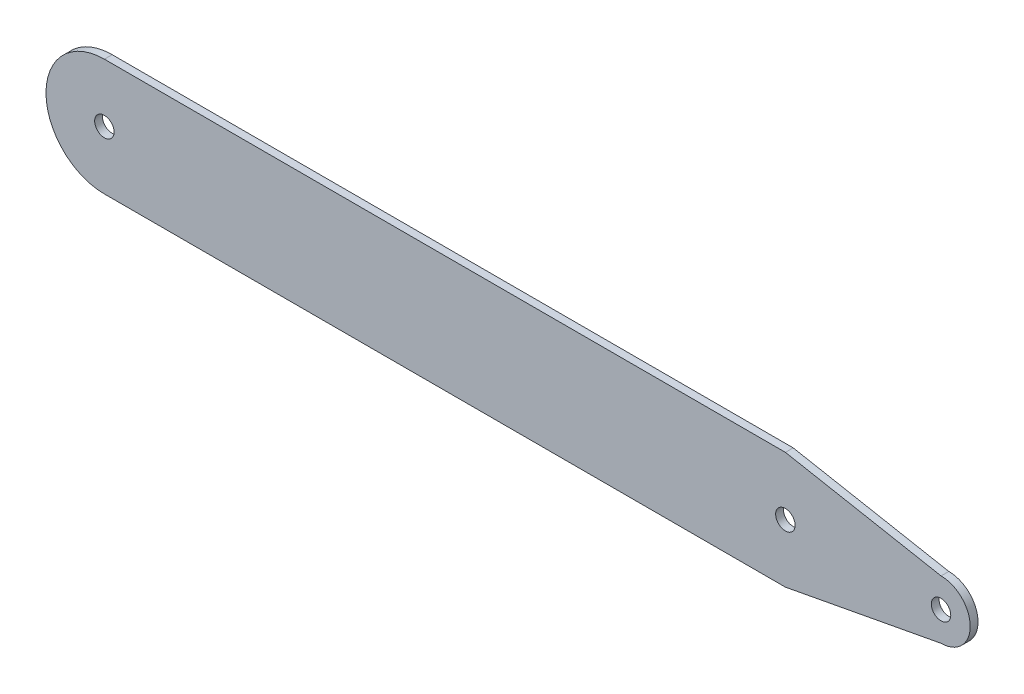
ISO-10303-21;
HEADER;
FILE_DESCRIPTION(('STEP AP214'),'2;1');
FILE_NAME('part.step','',(''),(''),'','','');
FILE_SCHEMA(('AUTOMOTIVE_DESIGN { 1 0 10303 214 1 1 1 1 }'));
ENDSEC;
DATA;
#1=APPLICATION_CONTEXT('core data for automotive mechanical design processes');
#2=APPLICATION_PROTOCOL_DEFINITION('international standard','automotive_design',2000,#1);
#3=PRODUCT_CONTEXT('',#1,'mechanical');
#4=PRODUCT('Part','Part','',(#3));
#5=PRODUCT_RELATED_PRODUCT_CATEGORY('part','',(#4));
#6=PRODUCT_DEFINITION_FORMATION('','',#4);
#7=PRODUCT_DEFINITION_CONTEXT('part definition',#1,'design');
#8=PRODUCT_DEFINITION('design','',#6,#7);
#9=PRODUCT_DEFINITION_SHAPE('','',#8);
#10=(LENGTH_UNIT() NAMED_UNIT(*) SI_UNIT(.MILLI.,.METRE.));
#11=(NAMED_UNIT(*) PLANE_ANGLE_UNIT() SI_UNIT($,.RADIAN.));
#12=(NAMED_UNIT(*) SI_UNIT($,.STERADIAN.) SOLID_ANGLE_UNIT());
#13=UNCERTAINTY_MEASURE_WITH_UNIT(LENGTH_MEASURE(1.E-05),#10,'distance_accuracy_value','');
#14=(GEOMETRIC_REPRESENTATION_CONTEXT(3) GLOBAL_UNCERTAINTY_ASSIGNED_CONTEXT((#13)) GLOBAL_UNIT_ASSIGNED_CONTEXT((#10,
#11,#12)) REPRESENTATION_CONTEXT('',''));
#15=CARTESIAN_POINT('',(0.,0.,0.));
#16=DIRECTION('',(0.,0.,1.));
#17=DIRECTION('',(1.,0.,0.));
#18=AXIS2_PLACEMENT_3D('',#15,#16,#17);
#19=CARTESIAN_POINT('',(428.542857142857,-0.145714285714277,4.));
#20=DIRECTION('',(0.,0.,1.));
#21=DIRECTION('',(1.,0.,0.));
#22=AXIS2_PLACEMENT_3D('',#19,#20,#21);
#23=PLANE('',#22);
#24=CARTESIAN_POINT('',(-1.45714285714287,-0.145714285714277,4.));
#25=DIRECTION('',(0.,0.,1.));
#26=DIRECTION('',(1.,0.,0.));
#27=AXIS2_PLACEMENT_3D('',#24,#25,#26);
#28=CIRCLE('',#27,5.);
#29=CARTESIAN_POINT('',(3.54285714285713,-0.145714285714277,4.));
#30=VERTEX_POINT('',#29);
#31=EDGE_CURVE('E207',#30,#30,#28,.T.);
#32=ORIENTED_EDGE('',*,*,#31,.F.);
#33=EDGE_LOOP('',(#32));
#34=FACE_BOUND('',#33,.T.);
#35=CARTESIAN_POINT('',(428.542857142857,-0.145714285714277,4.));
#36=DIRECTION('',(0.,0.,1.));
#37=DIRECTION('',(1.,0.,0.));
#38=AXIS2_PLACEMENT_3D('',#35,#36,#37);
#39=CIRCLE('',#38,15.);
#40=CARTESIAN_POINT('',(428.542857142857,-15.1457142857143,4.));
#41=VERTEX_POINT('',#40);
#42=CARTESIAN_POINT('',(428.542857142857,14.8542857142857,4.));
#43=VERTEX_POINT('',#42);
#44=EDGE_CURVE('E146',#41,#43,#39,.T.);
#45=ORIENTED_EDGE('',*,*,#44,.T.);
#46=DIRECTION('',(-0.982872186934322,0.184288535050186,0.));
#47=VECTOR('',#46,1.);
#48=CARTESIAN_POINT('',(428.542857142857,14.8542857142857,4.));
#49=LINE('',#48,#47);
#50=CARTESIAN_POINT('',(348.542857142857,29.8542857142858,4.));
#51=VERTEX_POINT('',#50);
#52=EDGE_CURVE('E94',#43,#51,#49,.T.);
#53=ORIENTED_EDGE('',*,*,#52,.T.);
#54=DIRECTION('',(-1.,0.,0.));
#55=VECTOR('',#54,1.);
#56=CARTESIAN_POINT('',(-1.45714285714287,29.8542857142857,4.));
#57=LINE('',#56,#55);
#58=CARTESIAN_POINT('',(-1.45714285714286,29.8542857142857,4.));
#59=VERTEX_POINT('',#58);
#60=EDGE_CURVE('E107',#51,#59,#57,.T.);
#61=ORIENTED_EDGE('',*,*,#60,.T.);
#62=CARTESIAN_POINT('',(-1.45714285714286,-0.145714285714277,4.));
#63=DIRECTION('',(0.,0.,1.));
#64=DIRECTION('',(-1.,0.,0.));
#65=AXIS2_PLACEMENT_3D('',#62,#63,#64);
#66=CIRCLE('',#65,30.);
#67=CARTESIAN_POINT('',(-1.45714285714287,-30.1457142857143,4.));
#68=VERTEX_POINT('',#67);
#69=EDGE_CURVE('E101',#59,#68,#66,.T.);
#70=ORIENTED_EDGE('',*,*,#69,.T.);
#71=DIRECTION('',(1.,0.,0.));
#72=VECTOR('',#71,1.);
#73=CARTESIAN_POINT('',(348.542857142857,-30.1457142857143,4.));
#74=LINE('',#73,#72);
#75=CARTESIAN_POINT('',(348.542857142857,-30.1457142857143,4.));
#76=VERTEX_POINT('',#75);
#77=EDGE_CURVE('E105',#68,#76,#74,.T.);
#78=ORIENTED_EDGE('',*,*,#77,.T.);
#79=DIRECTION('',(0.982872186934322,0.184288535050186,0.));
#80=VECTOR('',#79,1.);
#81=CARTESIAN_POINT('',(428.542857142857,-15.1457142857143,4.));
#82=LINE('',#81,#80);
#83=EDGE_CURVE('E57',#76,#41,#82,.T.);
#84=ORIENTED_EDGE('',*,*,#83,.T.);
#85=EDGE_LOOP('',(#45,#53,#61,#70,#78,#84));
#86=FACE_BOUND('',#85,.T.);
#87=CARTESIAN_POINT('',(428.542857142857,-0.145714285714277,4.));
#88=DIRECTION('',(0.,0.,1.));
#89=DIRECTION('',(1.,0.,0.));
#90=AXIS2_PLACEMENT_3D('',#87,#88,#89);
#91=CIRCLE('',#90,4.99999999999999);
#92=CARTESIAN_POINT('',(433.542857142857,-0.145714285714277,4.));
#93=VERTEX_POINT('',#92);
#94=EDGE_CURVE('E134',#93,#93,#91,.T.);
#95=ORIENTED_EDGE('',*,*,#94,.F.);
#96=EDGE_LOOP('',(#95));
#97=FACE_BOUND('',#96,.T.);
#98=CARTESIAN_POINT('',(348.542857142857,-0.145714285714277,4.));
#99=DIRECTION('',(0.,0.,1.));
#100=DIRECTION('',(1.,0.,0.));
#101=AXIS2_PLACEMENT_3D('',#98,#99,#100);
#102=CIRCLE('',#101,4.99999999999999);
#103=CARTESIAN_POINT('',(353.542857142857,-0.145714285714277,4.));
#104=VERTEX_POINT('',#103);
#105=EDGE_CURVE('E196',#104,#104,#102,.T.);
#106=ORIENTED_EDGE('',*,*,#105,.F.);
#107=EDGE_LOOP('',(#106));
#108=FACE_BOUND('',#107,.T.);
#109=ADVANCED_FACE('F39',(#34,#86,#97,#108),#23,.T.);
#110=CARTESIAN_POINT('',(428.542857142857,-0.145714285714277,0.));
#111=DIRECTION('',(0.,0.,1.));
#112=DIRECTION('',(1.,0.,0.));
#113=AXIS2_PLACEMENT_3D('',#110,#111,#112);
#114=PLANE('',#113);
#115=CARTESIAN_POINT('',(428.542857142857,-0.145714285714277,0.));
#116=DIRECTION('',(0.,0.,1.));
#117=DIRECTION('',(1.,0.,0.));
#118=AXIS2_PLACEMENT_3D('',#115,#116,#117);
#119=CIRCLE('',#118,15.);
#120=CARTESIAN_POINT('',(428.542857142857,-15.1457142857143,0.));
#121=VERTEX_POINT('',#120);
#122=CARTESIAN_POINT('',(428.542857142857,14.8542857142857,0.));
#123=VERTEX_POINT('',#122);
#124=EDGE_CURVE('E129',#121,#123,#119,.T.);
#125=ORIENTED_EDGE('',*,*,#124,.F.);
#126=DIRECTION('',(0.982872186934322,0.184288535050186,0.));
#127=VECTOR('',#126,1.);
#128=CARTESIAN_POINT('',(428.542857142857,-15.1457142857143,0.));
#129=LINE('',#128,#127);
#130=CARTESIAN_POINT('',(348.542857142857,-30.1457142857143,0.));
#131=VERTEX_POINT('',#130);
#132=EDGE_CURVE('E86',#131,#121,#129,.T.);
#133=ORIENTED_EDGE('',*,*,#132,.F.);
#134=DIRECTION('',(1.,0.,0.));
#135=VECTOR('',#134,1.);
#136=CARTESIAN_POINT('',(348.542857142857,-30.1457142857143,0.));
#137=LINE('',#136,#135);
#138=CARTESIAN_POINT('',(-1.45714285714287,-30.1457142857143,0.));
#139=VERTEX_POINT('',#138);
#140=EDGE_CURVE('E80',#139,#131,#137,.T.);
#141=ORIENTED_EDGE('',*,*,#140,.F.);
#142=CARTESIAN_POINT('',(-1.45714285714286,-0.145714285714277,0.));
#143=DIRECTION('',(0.,0.,1.));
#144=DIRECTION('',(-1.,0.,0.));
#145=AXIS2_PLACEMENT_3D('',#142,#143,#144);
#146=CIRCLE('',#145,30.);
#147=CARTESIAN_POINT('',(-1.45714285714286,29.8542857142857,0.));
#148=VERTEX_POINT('',#147);
#149=EDGE_CURVE('E116',#148,#139,#146,.T.);
#150=ORIENTED_EDGE('',*,*,#149,.F.);
#151=DIRECTION('',(-1.,0.,0.));
#152=VECTOR('',#151,1.);
#153=CARTESIAN_POINT('',(-1.45714285714287,29.8542857142857,0.));
#154=LINE('',#153,#152);
#155=CARTESIAN_POINT('',(348.542857142857,29.8542857142858,0.));
#156=VERTEX_POINT('',#155);
#157=EDGE_CURVE('E137',#156,#148,#154,.T.);
#158=ORIENTED_EDGE('',*,*,#157,.F.);
#159=DIRECTION('',(-0.982872186934322,0.184288535050186,0.));
#160=VECTOR('',#159,1.);
#161=CARTESIAN_POINT('',(428.542857142857,14.8542857142857,0.));
#162=LINE('',#161,#160);
#163=EDGE_CURVE('E133',#123,#156,#162,.T.);
#164=ORIENTED_EDGE('',*,*,#163,.F.);
#165=EDGE_LOOP('',(#125,#133,#141,#150,#158,#164));
#166=FACE_BOUND('',#165,.T.);
#167=CARTESIAN_POINT('',(428.542857142857,-0.145714285714277,0.));
#168=DIRECTION('',(0.,0.,1.));
#169=DIRECTION('',(1.,0.,0.));
#170=AXIS2_PLACEMENT_3D('',#167,#168,#169);
#171=CIRCLE('',#170,4.99999999999999);
#172=CARTESIAN_POINT('',(433.542857142857,-0.145714285714277,0.));
#173=VERTEX_POINT('',#172);
#174=EDGE_CURVE('E211',#173,#173,#171,.T.);
#175=ORIENTED_EDGE('',*,*,#174,.T.);
#176=EDGE_LOOP('',(#175));
#177=FACE_BOUND('',#176,.T.);
#178=CARTESIAN_POINT('',(-1.45714285714287,-0.145714285714277,0.));
#179=DIRECTION('',(0.,0.,1.));
#180=DIRECTION('',(1.,0.,0.));
#181=AXIS2_PLACEMENT_3D('',#178,#179,#180);
#182=CIRCLE('',#181,5.);
#183=CARTESIAN_POINT('',(3.54285714285713,-0.145714285714277,0.));
#184=VERTEX_POINT('',#183);
#185=EDGE_CURVE('E204',#184,#184,#182,.T.);
#186=ORIENTED_EDGE('',*,*,#185,.T.);
#187=EDGE_LOOP('',(#186));
#188=FACE_BOUND('',#187,.T.);
#189=CARTESIAN_POINT('',(348.542857142857,-0.145714285714277,0.));
#190=DIRECTION('',(0.,0.,1.));
#191=DIRECTION('',(1.,0.,0.));
#192=AXIS2_PLACEMENT_3D('',#189,#190,#191);
#193=CIRCLE('',#192,4.99999999999999);
#194=CARTESIAN_POINT('',(353.542857142857,-0.145714285714277,0.));
#195=VERTEX_POINT('',#194);
#196=EDGE_CURVE('E199',#195,#195,#193,.T.);
#197=ORIENTED_EDGE('',*,*,#196,.T.);
#198=EDGE_LOOP('',(#197));
#199=FACE_BOUND('',#198,.T.);
#200=ADVANCED_FACE('F159',(#166,#177,#188,#199),#114,.F.);
#201=CARTESIAN_POINT('',(428.542857142857,-0.145714285714277,4.));
#202=DIRECTION('',(0.,0.,-1.));
#203=DIRECTION('',(-1.,0.,0.));
#204=AXIS2_PLACEMENT_3D('',#201,#202,#203);
#205=CYLINDRICAL_SURFACE('',#204,15.);
#206=ORIENTED_EDGE('',*,*,#124,.T.);
#207=DIRECTION('',(0.,0.,-1.));
#208=VECTOR('',#207,1.);
#209=CARTESIAN_POINT('',(428.542857142857,14.8542857142857,4.));
#210=LINE('',#209,#208);
#211=EDGE_CURVE('E11',#43,#123,#210,.T.);
#212=ORIENTED_EDGE('',*,*,#211,.F.);
#213=ORIENTED_EDGE('',*,*,#44,.F.);
#214=DIRECTION('',(0.,0.,-1.));
#215=VECTOR('',#214,1.);
#216=CARTESIAN_POINT('',(428.542857142857,-15.1457142857143,4.));
#217=LINE('',#216,#215);
#218=EDGE_CURVE('E125',#41,#121,#217,.T.);
#219=ORIENTED_EDGE('',*,*,#218,.T.);
#220=EDGE_LOOP('',(#206,#212,#213,#219));
#221=FACE_BOUND('',#220,.T.);
#222=ADVANCED_FACE('F41',(#221),#205,.T.);
#223=CARTESIAN_POINT('',(428.542857142857,14.8542857142857,4.));
#224=DIRECTION('',(-0.184288535050186,-0.982872186934322,0.));
#225=DIRECTION('',(0.982872186934322,-0.184288535050186,0.));
#226=AXIS2_PLACEMENT_3D('',#223,#224,#225);
#227=PLANE('',#226);
#228=ORIENTED_EDGE('',*,*,#163,.T.);
#229=DIRECTION('',(0.,0.,-1.));
#230=VECTOR('',#229,1.);
#231=CARTESIAN_POINT('',(348.542857142857,29.8542857142858,4.));
#232=LINE('',#231,#230);
#233=EDGE_CURVE('E49',#51,#156,#232,.T.);
#234=ORIENTED_EDGE('',*,*,#233,.F.);
#235=ORIENTED_EDGE('',*,*,#52,.F.);
#236=ORIENTED_EDGE('',*,*,#211,.T.);
#237=EDGE_LOOP('',(#228,#234,#235,#236));
#238=FACE_BOUND('',#237,.T.);
#239=ADVANCED_FACE('F267',(#238),#227,.F.);
#240=CARTESIAN_POINT('',(-1.45714285714287,29.8542857142857,4.));
#241=DIRECTION('',(0.,-1.,0.));
#242=DIRECTION('',(1.,0.,0.));
#243=AXIS2_PLACEMENT_3D('',#240,#241,#242);
#244=PLANE('',#243);
#245=ORIENTED_EDGE('',*,*,#157,.T.);
#246=DIRECTION('',(0.,0.,-1.));
#247=VECTOR('',#246,1.);
#248=CARTESIAN_POINT('',(-1.45714285714286,29.8542857142857,4.));
#249=LINE('',#248,#247);
#250=EDGE_CURVE('E118',#59,#148,#249,.T.);
#251=ORIENTED_EDGE('',*,*,#250,.F.);
#252=ORIENTED_EDGE('',*,*,#60,.F.);
#253=ORIENTED_EDGE('',*,*,#233,.T.);
#254=EDGE_LOOP('',(#245,#251,#252,#253));
#255=FACE_BOUND('',#254,.T.);
#256=ADVANCED_FACE('F156',(#255),#244,.F.);
#257=CARTESIAN_POINT('',(-1.45714285714286,-0.145714285714277,4.));
#258=DIRECTION('',(0.,0.,-1.));
#259=DIRECTION('',(-1.,0.,0.));
#260=AXIS2_PLACEMENT_3D('',#257,#258,#259);
#261=CYLINDRICAL_SURFACE('',#260,30.);
#262=ORIENTED_EDGE('',*,*,#149,.T.);
#263=DIRECTION('',(0.,0.,-1.));
#264=VECTOR('',#263,1.);
#265=CARTESIAN_POINT('',(-1.45714285714287,-30.1457142857143,4.));
#266=LINE('',#265,#264);
#267=EDGE_CURVE('E113',#68,#139,#266,.T.);
#268=ORIENTED_EDGE('',*,*,#267,.F.);
#269=ORIENTED_EDGE('',*,*,#69,.F.);
#270=ORIENTED_EDGE('',*,*,#250,.T.);
#271=EDGE_LOOP('',(#262,#268,#269,#270));
#272=FACE_BOUND('',#271,.T.);
#273=ADVANCED_FACE('F114',(#272),#261,.T.);
#274=CARTESIAN_POINT('',(348.542857142857,-30.1457142857143,4.));
#275=DIRECTION('',(0.,1.,0.));
#276=DIRECTION('',(-1.,0.,0.));
#277=AXIS2_PLACEMENT_3D('',#274,#275,#276);
#278=PLANE('',#277);
#279=ORIENTED_EDGE('',*,*,#140,.T.);
#280=DIRECTION('',(0.,0.,-1.));
#281=VECTOR('',#280,1.);
#282=CARTESIAN_POINT('',(348.542857142857,-30.1457142857143,4.));
#283=LINE('',#282,#281);
#284=EDGE_CURVE('E119',#76,#131,#283,.T.);
#285=ORIENTED_EDGE('',*,*,#284,.F.);
#286=ORIENTED_EDGE('',*,*,#77,.F.);
#287=ORIENTED_EDGE('',*,*,#267,.T.);
#288=EDGE_LOOP('',(#279,#285,#286,#287));
#289=FACE_BOUND('',#288,.T.);
#290=ADVANCED_FACE('F121',(#289),#278,.F.);
#291=CARTESIAN_POINT('',(428.542857142857,-15.1457142857143,4.));
#292=DIRECTION('',(-0.184288535050186,0.982872186934322,0.));
#293=DIRECTION('',(-0.982872186934322,-0.184288535050186,0.));
#294=AXIS2_PLACEMENT_3D('',#291,#292,#293);
#295=PLANE('',#294);
#296=ORIENTED_EDGE('',*,*,#132,.T.);
#297=ORIENTED_EDGE('',*,*,#218,.F.);
#298=ORIENTED_EDGE('',*,*,#83,.F.);
#299=ORIENTED_EDGE('',*,*,#284,.T.);
#300=EDGE_LOOP('',(#296,#297,#298,#299));
#301=FACE_BOUND('',#300,.T.);
#302=ADVANCED_FACE('F164',(#301),#295,.F.);
#303=CARTESIAN_POINT('',(428.542857142857,-0.145714285714277,4.));
#304=DIRECTION('',(0.,0.,-1.));
#305=DIRECTION('',(-1.,0.,0.));
#306=AXIS2_PLACEMENT_3D('',#303,#304,#305);
#307=CYLINDRICAL_SURFACE('',#306,4.99999999999999);
#308=ORIENTED_EDGE('',*,*,#94,.T.);
#309=EDGE_LOOP('',(#308));
#310=FACE_BOUND('',#309,.T.);
#311=ORIENTED_EDGE('',*,*,#174,.F.);
#312=EDGE_LOOP('',(#311));
#313=FACE_BOUND('',#312,.T.);
#314=ADVANCED_FACE('F166',(#310,#313),#307,.F.);
#315=CARTESIAN_POINT('',(-1.45714285714287,-0.145714285714277,4.));
#316=DIRECTION('',(0.,0.,-1.));
#317=DIRECTION('',(-1.,0.,0.));
#318=AXIS2_PLACEMENT_3D('',#315,#316,#317);
#319=CYLINDRICAL_SURFACE('',#318,5.);
#320=ORIENTED_EDGE('',*,*,#31,.T.);
#321=EDGE_LOOP('',(#320));
#322=FACE_BOUND('',#321,.T.);
#323=ORIENTED_EDGE('',*,*,#185,.F.);
#324=EDGE_LOOP('',(#323));
#325=FACE_BOUND('',#324,.T.);
#326=ADVANCED_FACE('F172',(#322,#325),#319,.F.);
#327=CARTESIAN_POINT('',(348.542857142857,-0.145714285714277,4.));
#328=DIRECTION('',(0.,0.,-1.));
#329=DIRECTION('',(-1.,0.,0.));
#330=AXIS2_PLACEMENT_3D('',#327,#328,#329);
#331=CYLINDRICAL_SURFACE('',#330,4.99999999999999);
#332=ORIENTED_EDGE('',*,*,#105,.T.);
#333=EDGE_LOOP('',(#332));
#334=FACE_BOUND('',#333,.T.);
#335=ORIENTED_EDGE('',*,*,#196,.F.);
#336=EDGE_LOOP('',(#335));
#337=FACE_BOUND('',#336,.T.);
#338=ADVANCED_FACE('F187',(#334,#337),#331,.F.);
#339=CLOSED_SHELL('',(#109,#200,#222,#239,#256,#273,#290,#302,#314,#326,#338));
#340=MANIFOLD_SOLID_BREP('B2',#339);
#341=ADVANCED_BREP_SHAPE_REPRESENTATION('',(#18,#340),#14);
#342=SHAPE_DEFINITION_REPRESENTATION(#9,#341);
ENDSEC;
END-ISO-10303-21;
